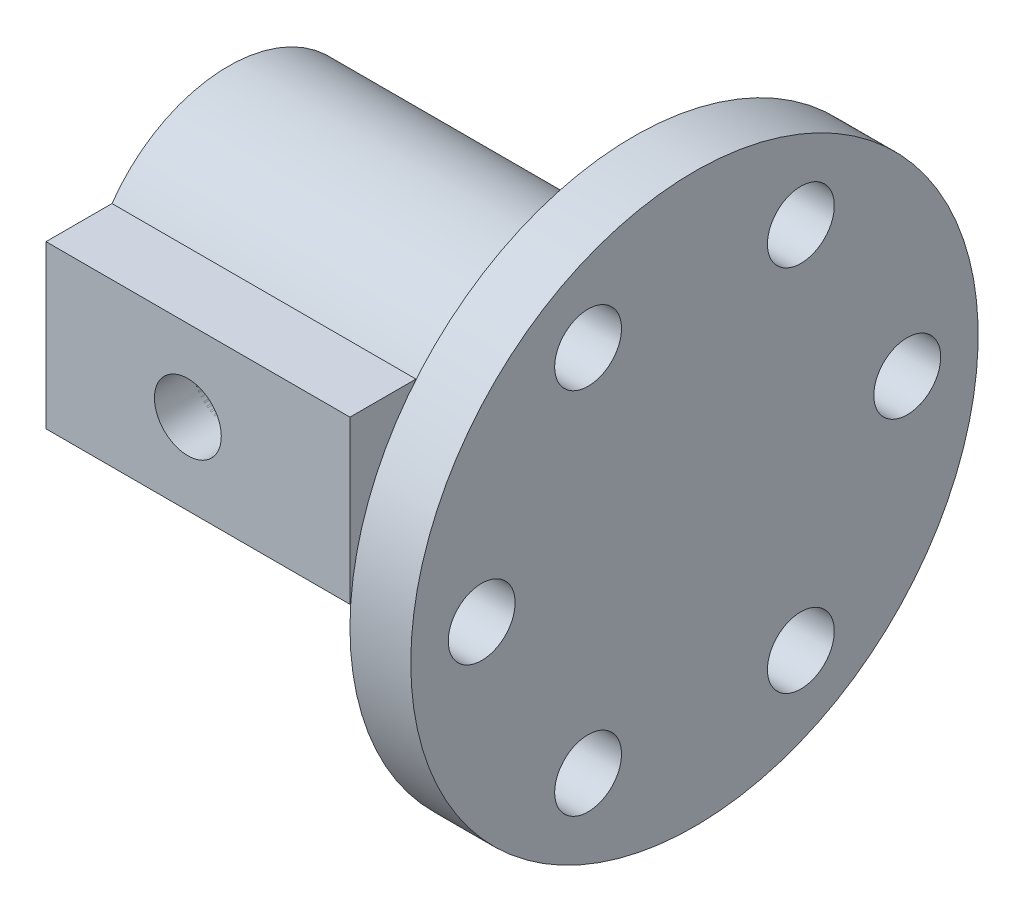
ISO-10303-21;
HEADER;
FILE_DESCRIPTION(('STEP AP214'),'2;1');
FILE_NAME('part.step','',(''),(''),'','','');
FILE_SCHEMA(('AUTOMOTIVE_DESIGN { 1 0 10303 214 1 1 1 1 }'));
ENDSEC;
DATA;
#1=APPLICATION_CONTEXT('core data for automotive mechanical design processes');
#2=APPLICATION_PROTOCOL_DEFINITION('international standard','automotive_design',2000,#1);
#3=PRODUCT_CONTEXT('',#1,'mechanical');
#4=PRODUCT('Part','Part','',(#3));
#5=PRODUCT_RELATED_PRODUCT_CATEGORY('part','',(#4));
#6=PRODUCT_DEFINITION_FORMATION('','',#4);
#7=PRODUCT_DEFINITION_CONTEXT('part definition',#1,'design');
#8=PRODUCT_DEFINITION('design','',#6,#7);
#9=PRODUCT_DEFINITION_SHAPE('','',#8);
#10=(LENGTH_UNIT() NAMED_UNIT(*) SI_UNIT(.MILLI.,.METRE.));
#11=(NAMED_UNIT(*) PLANE_ANGLE_UNIT() SI_UNIT($,.RADIAN.));
#12=(NAMED_UNIT(*) SI_UNIT($,.STERADIAN.) SOLID_ANGLE_UNIT());
#13=UNCERTAINTY_MEASURE_WITH_UNIT(LENGTH_MEASURE(1.E-05),#10,'distance_accuracy_value','');
#14=(GEOMETRIC_REPRESENTATION_CONTEXT(3) GLOBAL_UNCERTAINTY_ASSIGNED_CONTEXT((#13)) GLOBAL_UNIT_ASSIGNED_CONTEXT((#10,
#11,#12)) REPRESENTATION_CONTEXT('',''));
#15=CARTESIAN_POINT('',(0.,0.,0.));
#16=DIRECTION('',(0.,0.,1.));
#17=DIRECTION('',(1.,0.,0.));
#18=AXIS2_PLACEMENT_3D('',#15,#16,#17);
#19=CARTESIAN_POINT('',(0.,4.,5.));
#20=DIRECTION('',(-1.,0.,0.));
#21=DIRECTION('',(0.,-1.,0.));
#22=AXIS2_PLACEMENT_3D('',#19,#20,#21);
#23=PLANE('',#22);
#24=DIRECTION('',(0.,0.,1.));
#25=VECTOR('',#24,1.);
#26=CARTESIAN_POINT('',(0.,-4.,5.));
#27=LINE('',#26,#25);
#28=CARTESIAN_POINT('',(0.,-4.,5.));
#29=VERTEX_POINT('',#28);
#30=CARTESIAN_POINT('',(0.,-4.,9.));
#31=VERTEX_POINT('',#30);
#32=EDGE_CURVE('E52',#29,#31,#27,.T.);
#33=ORIENTED_EDGE('',*,*,#32,.T.);
#34=DIRECTION('',(0.,-1.,0.));
#35=VECTOR('',#34,1.);
#36=CARTESIAN_POINT('',(0.,4.,9.));
#37=LINE('',#36,#35);
#38=CARTESIAN_POINT('',(0.,4.,9.));
#39=VERTEX_POINT('',#38);
#40=EDGE_CURVE('E89',#39,#31,#37,.T.);
#41=ORIENTED_EDGE('',*,*,#40,.F.);
#42=DIRECTION('',(0.,0.,1.));
#43=VECTOR('',#42,1.);
#44=CARTESIAN_POINT('',(0.,4.,5.));
#45=LINE('',#44,#43);
#46=CARTESIAN_POINT('',(0.,4.,5.));
#47=VERTEX_POINT('',#46);
#48=EDGE_CURVE('E12',#47,#39,#45,.T.);
#49=ORIENTED_EDGE('',*,*,#48,.F.);
#50=DIRECTION('',(0.,-1.,0.));
#51=VECTOR('',#50,1.);
#52=CARTESIAN_POINT('',(0.,4.,5.));
#53=LINE('',#52,#51);
#54=EDGE_CURVE('E90',#47,#29,#53,.T.);
#55=ORIENTED_EDGE('',*,*,#54,.T.);
#56=EDGE_LOOP('',(#33,#41,#49,#55));
#57=FACE_BOUND('',#56,.T.);
#58=ADVANCED_FACE('F49',(#57),#23,.T.);
#59=CARTESIAN_POINT('',(0.,4.,5.));
#60=DIRECTION('',(0.,1.,0.));
#61=DIRECTION('',(0.,0.,1.));
#62=AXIS2_PLACEMENT_3D('',#59,#60,#61);
#63=PLANE('',#62);
#64=ORIENTED_EDGE('',*,*,#48,.T.);
#65=DIRECTION('',(-1.,0.,0.));
#66=VECTOR('',#65,1.);
#67=CARTESIAN_POINT('',(0.,4.,9.));
#68=LINE('',#67,#66);
#69=CARTESIAN_POINT('',(15.,4.,9.));
#70=VERTEX_POINT('',#69);
#71=EDGE_CURVE('E107',#70,#39,#68,.T.);
#72=ORIENTED_EDGE('',*,*,#71,.F.);
#73=DIRECTION('',(0.,0.,1.));
#74=VECTOR('',#73,1.);
#75=CARTESIAN_POINT('',(15.,4.,5.));
#76=LINE('',#75,#74);
#77=CARTESIAN_POINT('',(15.,4.,5.));
#78=VERTEX_POINT('',#77);
#79=EDGE_CURVE('E57',#78,#70,#76,.T.);
#80=ORIENTED_EDGE('',*,*,#79,.F.);
#81=DIRECTION('',(-1.,0.,0.));
#82=VECTOR('',#81,1.);
#83=CARTESIAN_POINT('',(0.,4.,5.));
#84=LINE('',#83,#82);
#85=EDGE_CURVE('E95',#78,#47,#84,.T.);
#86=ORIENTED_EDGE('',*,*,#85,.T.);
#87=EDGE_LOOP('',(#64,#72,#80,#86));
#88=FACE_BOUND('',#87,.T.);
#89=ADVANCED_FACE('F128',(#88),#63,.T.);
#90=CARTESIAN_POINT('',(15.,4.,5.));
#91=DIRECTION('',(1.,0.,0.));
#92=DIRECTION('',(0.,1.,0.));
#93=AXIS2_PLACEMENT_3D('',#90,#91,#92);
#94=PLANE('',#93);
#95=ORIENTED_EDGE('',*,*,#79,.T.);
#96=DIRECTION('',(0.,1.,0.));
#97=VECTOR('',#96,1.);
#98=CARTESIAN_POINT('',(15.,4.,9.));
#99=LINE('',#98,#97);
#100=CARTESIAN_POINT('',(15.,-4.,9.));
#101=VERTEX_POINT('',#100);
#102=EDGE_CURVE('E102',#101,#70,#99,.T.);
#103=ORIENTED_EDGE('',*,*,#102,.F.);
#104=DIRECTION('',(0.,0.,1.));
#105=VECTOR('',#104,1.);
#106=CARTESIAN_POINT('',(15.,-4.,5.));
#107=LINE('',#106,#105);
#108=CARTESIAN_POINT('',(15.,-4.,5.));
#109=VERTEX_POINT('',#108);
#110=EDGE_CURVE('E94',#109,#101,#107,.T.);
#111=ORIENTED_EDGE('',*,*,#110,.F.);
#112=DIRECTION('',(0.,1.,0.));
#113=VECTOR('',#112,1.);
#114=CARTESIAN_POINT('',(15.,4.,5.));
#115=LINE('',#114,#113);
#116=EDGE_CURVE('E121',#109,#78,#115,.T.);
#117=ORIENTED_EDGE('',*,*,#116,.T.);
#118=EDGE_LOOP('',(#95,#103,#111,#117));
#119=FACE_BOUND('',#118,.T.);
#120=ADVANCED_FACE('F125',(#119),#94,.T.);
#121=CARTESIAN_POINT('',(0.,-4.,5.));
#122=DIRECTION('',(0.,-1.,0.));
#123=DIRECTION('',(0.,0.,-1.));
#124=AXIS2_PLACEMENT_3D('',#121,#122,#123);
#125=PLANE('',#124);
#126=ORIENTED_EDGE('',*,*,#110,.T.);
#127=DIRECTION('',(1.,0.,0.));
#128=VECTOR('',#127,1.);
#129=CARTESIAN_POINT('',(0.,-4.,9.));
#130=LINE('',#129,#128);
#131=EDGE_CURVE('E97',#31,#101,#130,.T.);
#132=ORIENTED_EDGE('',*,*,#131,.F.);
#133=ORIENTED_EDGE('',*,*,#32,.F.);
#134=DIRECTION('',(1.,0.,0.));
#135=VECTOR('',#134,1.);
#136=CARTESIAN_POINT('',(0.,-4.,5.));
#137=LINE('',#136,#135);
#138=EDGE_CURVE('E119',#29,#109,#137,.T.);
#139=ORIENTED_EDGE('',*,*,#138,.T.);
#140=EDGE_LOOP('',(#126,#132,#133,#139));
#141=FACE_BOUND('',#140,.T.);
#142=ADVANCED_FACE('F98',(#141),#125,.T.);
#143=CARTESIAN_POINT('',(0.,0.,5.));
#144=DIRECTION('',(0.,0.,1.));
#145=DIRECTION('',(1.,0.,0.));
#146=AXIS2_PLACEMENT_3D('',#143,#144,#145);
#147=PLANE('',#146);
#148=CARTESIAN_POINT('',(7.,0.,5.));
#149=DIRECTION('',(0.,0.,1.));
#150=DIRECTION('',(1.,0.,0.));
#151=AXIS2_PLACEMENT_3D('',#148,#149,#150);
#152=CIRCLE('',#151,1.65);
#153=CARTESIAN_POINT('',(8.65,0.,5.));
#154=VERTEX_POINT('',#153);
#155=EDGE_CURVE('E115',#154,#154,#152,.T.);
#156=ORIENTED_EDGE('',*,*,#155,.T.);
#157=EDGE_LOOP('',(#156));
#158=FACE_BOUND('',#157,.T.);
#159=ORIENTED_EDGE('',*,*,#54,.F.);
#160=ORIENTED_EDGE('',*,*,#85,.F.);
#161=ORIENTED_EDGE('',*,*,#116,.F.);
#162=ORIENTED_EDGE('',*,*,#138,.F.);
#163=EDGE_LOOP('',(#159,#160,#161,#162));
#164=FACE_BOUND('',#163,.T.);
#165=ADVANCED_FACE('F130',(#158,#164),#147,.F.);
#166=CARTESIAN_POINT('',(7.,0.,5.));
#167=DIRECTION('',(0.,0.,1.));
#168=DIRECTION('',(1.,0.,0.));
#169=AXIS2_PLACEMENT_3D('',#166,#167,#168);
#170=CYLINDRICAL_SURFACE('',#169,1.65);
#171=ORIENTED_EDGE('',*,*,#155,.F.);
#172=EDGE_LOOP('',(#171));
#173=FACE_BOUND('',#172,.T.);
#174=CARTESIAN_POINT('',(7.,0.,9.));
#175=DIRECTION('',(0.,0.,1.));
#176=DIRECTION('',(1.,0.,0.));
#177=AXIS2_PLACEMENT_3D('',#174,#175,#176);
#178=CIRCLE('',#177,1.65);
#179=CARTESIAN_POINT('',(8.65,0.,9.));
#180=VERTEX_POINT('',#179);
#181=EDGE_CURVE('E108',#180,#180,#178,.T.);
#182=ORIENTED_EDGE('',*,*,#181,.T.);
#183=EDGE_LOOP('',(#182));
#184=FACE_BOUND('',#183,.T.);
#185=ADVANCED_FACE('F132',(#173,#184),#170,.F.);
#186=CARTESIAN_POINT('',(0.,0.,9.));
#187=DIRECTION('',(0.,0.,1.));
#188=DIRECTION('',(1.,0.,0.));
#189=AXIS2_PLACEMENT_3D('',#186,#187,#188);
#190=PLANE('',#189);
#191=ORIENTED_EDGE('',*,*,#40,.T.);
#192=ORIENTED_EDGE('',*,*,#131,.T.);
#193=ORIENTED_EDGE('',*,*,#102,.T.);
#194=ORIENTED_EDGE('',*,*,#71,.T.);
#195=EDGE_LOOP('',(#191,#192,#193,#194));
#196=FACE_BOUND('',#195,.T.);
#197=ORIENTED_EDGE('',*,*,#181,.F.);
#198=EDGE_LOOP('',(#197));
#199=FACE_BOUND('',#198,.T.);
#200=ADVANCED_FACE('F105',(#196,#199),#190,.T.);
#201=CLOSED_SHELL('',(#58,#89,#120,#142,#165,#185,#200));
#202=MANIFOLD_SOLID_BREP('B2',#201);
#203=CARTESIAN_POINT('',(0.,0.,0.));
#204=DIRECTION('',(1.,0.,0.));
#205=DIRECTION('',(0.,0.,-1.));
#206=AXIS2_PLACEMENT_3D('',#203,#204,#205);
#207=PLANE('',#206);
#208=CARTESIAN_POINT('',(0.,0.,0.));
#209=DIRECTION('',(-1.,0.,0.));
#210=DIRECTION('',(0.,0.,1.));
#211=AXIS2_PLACEMENT_3D('',#208,#209,#210);
#212=CIRCLE('',#211,3.15);
#213=CARTESIAN_POINT('',(0.,0.,3.15));
#214=VERTEX_POINT('',#213);
#215=EDGE_CURVE('E238',#214,#214,#212,.T.);
#216=ORIENTED_EDGE('',*,*,#215,.F.);
#217=EDGE_LOOP('',(#216));
#218=FACE_BOUND('',#217,.T.);
#219=CARTESIAN_POINT('',(0.,0.,0.));
#220=DIRECTION('',(-1.,0.,0.));
#221=DIRECTION('',(0.,0.,1.));
#222=AXIS2_PLACEMENT_3D('',#219,#220,#221);
#223=CIRCLE('',#222,7.);
#224=CARTESIAN_POINT('',(0.,0.,7.));
#225=VERTEX_POINT('',#224);
#226=EDGE_CURVE('E205',#225,#225,#223,.T.);
#227=ORIENTED_EDGE('',*,*,#226,.T.);
#228=EDGE_LOOP('',(#227));
#229=FACE_BOUND('',#228,.T.);
#230=ADVANCED_FACE('F194',(#218,#229),#207,.F.);
#231=CARTESIAN_POINT('',(0.,0.,0.));
#232=DIRECTION('',(-1.,0.,0.));
#233=DIRECTION('',(0.,0.,1.));
#234=AXIS2_PLACEMENT_3D('',#231,#232,#233);
#235=CYLINDRICAL_SURFACE('',#234,7.);
#236=CARTESIAN_POINT('',(19.,0.,0.));
#237=DIRECTION('',(1.,0.,0.));
#238=DIRECTION('',(0.,0.,-1.));
#239=AXIS2_PLACEMENT_3D('',#236,#237,#238);
#240=CIRCLE('',#239,7.);
#241=CARTESIAN_POINT('',(19.,0.,-7.));
#242=VERTEX_POINT('',#241);
#243=EDGE_CURVE('E201',#242,#242,#240,.F.);
#244=ORIENTED_EDGE('',*,*,#243,.T.);
#245=EDGE_LOOP('',(#244));
#246=FACE_BOUND('',#245,.T.);
#247=CARTESIAN_POINT('',(8.65,0.,7.));
#248=CARTESIAN_POINT('',(8.64999715612092,-0.0913287393176135,6.99999836647252));
#249=CARTESIAN_POINT('',(8.64239176915064,-0.182690417283303,6.99819467849873));
#250=CARTESIAN_POINT('',(8.61221009853048,-0.362806323664361,6.9911739036526));
#251=CARTESIAN_POINT('',(8.58962428672524,-0.451558855012934,6.98595464436712));
#252=CARTESIAN_POINT('',(8.53023822598253,-0.623828476855957,6.97268218331077));
#253=CARTESIAN_POINT('',(8.49345400799298,-0.707351348819676,6.96463217854926));
#254=CARTESIAN_POINT('',(8.40676915128466,-0.867039208328408,6.9465609541058));
#255=CARTESIAN_POINT('',(8.35686843304705,-0.943204151262114,6.93653972247338));
#256=CARTESIAN_POINT('',(8.24439317834774,-1.0874214344422,6.91541181493805));
#257=CARTESIAN_POINT('',(8.18162244644474,-1.15531854158778,6.90428991213628));
#258=CARTESIAN_POINT('',(8.04560959082672,-1.27972508274131,6.88231817514457));
#259=CARTESIAN_POINT('',(7.97236640897828,-1.33623336463363,6.87146836857753));
#260=CARTESIAN_POINT('',(7.81630963254398,-1.43696684618771,6.85111743990827));
#261=CARTESIAN_POINT('',(7.7333837495766,-1.48102236520305,6.84163573776828));
#262=CARTESIAN_POINT('',(7.56104427829788,-1.5545098915109,6.8253150534534));
#263=CARTESIAN_POINT('',(7.47163160394849,-1.58394395433771,6.81847569983818));
#264=CARTESIAN_POINT('',(7.29055302796902,-1.62683125284546,6.80836995693016));
#265=CARTESIAN_POINT('',(7.19895629577561,-1.64056162843084,6.80504168835829));
#266=CARTESIAN_POINT('',(7.01470364633588,-1.65251435457551,6.80214944752778));
#267=CARTESIAN_POINT('',(6.92204788316596,-1.65073893306961,6.80258493447765));
#268=CARTESIAN_POINT('',(6.74040081920414,-1.63195247769315,6.80711518628286));
#269=CARTESIAN_POINT('',(6.65137352003667,-1.61526770664355,6.81113158544196));
#270=CARTESIAN_POINT('',(6.47741848048742,-1.56765494743684,6.82224669705885));
#271=CARTESIAN_POINT('',(6.39249100344399,-1.53672604569693,6.82934560721949));
#272=CARTESIAN_POINT('',(6.22825160294738,-1.46121486998613,6.84590028619908));
#273=CARTESIAN_POINT('',(6.14899783060348,-1.41651088097455,6.85537691977426));
#274=CARTESIAN_POINT('',(5.99899787905211,-1.31480384080152,6.87560701771075));
#275=CARTESIAN_POINT('',(5.92825303741629,-1.25779885989579,6.88636068228984));
#276=CARTESIAN_POINT('',(5.79540520230351,-1.13140044923306,6.90826612497408));
#277=CARTESIAN_POINT('',(5.73356537204603,-1.06173067039408,6.91942110106381));
#278=CARTESIAN_POINT('',(5.62240035299906,-0.912878848692461,6.940626418642));
#279=CARTESIAN_POINT('',(5.57307546763307,-0.833696575268991,6.95067673334471));
#280=CARTESIAN_POINT('',(5.48825897652052,-0.667717693598602,6.96858169507369));
#281=CARTESIAN_POINT('',(5.45280620132093,-0.580900533100763,6.97643016161575));
#282=CARTESIAN_POINT('',(5.39706844656342,-0.402313719817368,6.98900179511064));
#283=CARTESIAN_POINT('',(5.37678089612248,-0.310544909289168,6.99372549177409));
#284=CARTESIAN_POINT('',(5.35234231566717,-0.12691319889921,6.9994383716222));
#285=CARTESIAN_POINT('',(5.34783240330128,-0.0351005767602221,7.00051059686152));
#286=CARTESIAN_POINT('',(5.35409827636913,0.147966685501655,6.99903444009398));
#287=CARTESIAN_POINT('',(5.36487284761622,0.239221369368363,6.99648634568227));
#288=CARTESIAN_POINT('',(5.40110507923741,0.417362653019771,6.98810869992012));
#289=CARTESIAN_POINT('',(5.42637051352431,0.504290552421104,6.98232213187253));
#290=CARTESIAN_POINT('',(5.49065065087642,0.672672276070121,6.96811723407212));
#291=CARTESIAN_POINT('',(5.52966664699561,0.754125584648712,6.9596986568229));
#292=CARTESIAN_POINT('',(5.62106042208636,0.910700498955398,6.94096161251794));
#293=CARTESIAN_POINT('',(5.67364386057601,0.985698570997653,6.93061465221504));
#294=CARTESIAN_POINT('',(5.79041331924251,1.1259344495591,6.90921937825115));
#295=CARTESIAN_POINT('',(5.85460110716109,1.19117076625592,6.89817095790026));
#296=CARTESIAN_POINT('',(5.99441505530595,1.31148229591091,6.87632466673189));
#297=CARTESIAN_POINT('',(6.07025861259663,1.36630717929423,6.865537385707));
#298=CARTESIAN_POINT('',(6.23028479232451,1.46244648293613,6.84570445168463));
#299=CARTESIAN_POINT('',(6.31446704173642,1.50376150719305,6.83665872083342));
#300=CARTESIAN_POINT('',(6.48832127446082,1.57141076668764,6.82142736146697));
#301=CARTESIAN_POINT('',(6.57795752685843,1.59783286852027,6.81522499881539));
#302=CARTESIAN_POINT('',(6.76056565583675,1.63519178674544,6.80635903572141));
#303=CARTESIAN_POINT('',(6.85353689432124,1.64613154940225,6.80369476199233));
#304=CARTESIAN_POINT('',(7.03764007583629,1.65207449167986,6.80225382726605));
#305=CARTESIAN_POINT('',(7.12875861310138,1.6474761616919,6.80337995460539));
#306=CARTESIAN_POINT('',(7.30888236366682,1.62337546677893,6.80917049161347));
#307=CARTESIAN_POINT('',(7.39788761066538,1.60387333967241,6.81383484482306));
#308=CARTESIAN_POINT('',(7.57088010606271,1.55072477614989,6.82612522897376));
#309=CARTESIAN_POINT('',(7.65488895775151,1.51714519678737,6.83373724790254));
#310=CARTESIAN_POINT('',(7.81613651147967,1.43684939858625,6.85106877692285));
#311=CARTESIAN_POINT('',(7.89337437975524,1.39013156490448,6.86078854604759));
#312=CARTESIAN_POINT('',(8.04083165170259,1.28360204537892,6.88152384189012));
#313=CARTESIAN_POINT('',(8.11084523110531,1.22351026298738,6.89256431174074));
#314=CARTESIAN_POINT('',(8.23992483888991,1.09249493531384,6.91453965388042));
#315=CARTESIAN_POINT('',(8.2989883028659,1.02156885982584,6.92547450086676));
#316=CARTESIAN_POINT('',(8.40538285532999,0.869562734220028,6.94620969725689));
#317=CARTESIAN_POINT('',(8.45251645356407,0.788341489140676,6.95598967744618));
#318=CARTESIAN_POINT('',(8.53238620957199,0.618909771082386,6.97310375804726));
#319=CARTESIAN_POINT('',(8.56513352737679,0.530704778601511,6.98043975328753));
#320=CARTESIAN_POINT('',(8.60997422050049,0.368778884805455,6.99064750922865));
#321=CARTESIAN_POINT('',(8.62495329121565,0.295881946838861,6.99413174237217));
#322=CARTESIAN_POINT('',(8.64496704386653,0.148663891408629,6.99880858473134));
#323=CARTESIAN_POINT('',(8.65000231495695,0.0743428585838589,7.00000132971399));
#324=CARTESIAN_POINT('',(8.65,0.,7.));
#325=B_SPLINE_CURVE_WITH_KNOTS('',3,(#247,#248,#249,#250,#251,#252,#253,#254,#255,#256,#257,
#258,#259,#260,#261,#262,#263,#264,#265,#266,#267,#268,#269,#270,#271,#272,#273,#274,#275,#276,
#277,#278,#279,#280,#281,#282,#283,#284,#285,#286,#287,#288,#289,#290,#291,#292,#293,#294,#295,
#296,#297,#298,#299,#300,#301,#302,#303,#304,#305,#306,#307,#308,#309,#310,#311,#312,#313,#314,
#315,#316,#317,#318,#319,#320,#321,#322,#323,#324),.UNSPECIFIED.,.T.,.F.,(4,2,2,2,2,2,2,2,2,2,2,
2,2,2,2,2,2,2,2,2,2,2,2,2,2,2,2,2,2,2,2,2,2,2,2,2,2,2,4),(0.,0.273713930465044,
0.547602121208314,0.82118197421838,1.09476348584583,1.37287554367487,1.65101572175226,
1.93278083587447,2.21450632727553,2.49117922951627,2.76781237894395,3.0385362810522,
3.30927754913057,3.58248319512941,3.85573173204488,4.13587649000043,4.41602803938654,
4.69695826763982,4.97784086042084,5.25229133365971,5.52672000600246,5.79758981692428,
6.06848510628021,6.34375631656429,6.61906949551376,6.9003381998144,7.18159432744314,
7.46117322376554,7.74069890951611,8.01311084713954,8.28551843800229,8.55664670189891,
8.82780830516573,9.10529722607675,9.38285105021364,9.66473658497752,9.94640306170603,
10.1692231938147,10.3920301237804),.UNSPECIFIED.);
#326=CARTESIAN_POINT('',(8.65,0.,7.));
#327=VERTEX_POINT('',#326);
#328=EDGE_CURVE('E219',#327,#327,#325,.T.);
#329=ORIENTED_EDGE('',*,*,#328,.T.);
#330=EDGE_LOOP('',(#329));
#331=FACE_BOUND('',#330,.T.);
#332=ORIENTED_EDGE('',*,*,#226,.F.);
#333=EDGE_LOOP('',(#332));
#334=FACE_BOUND('',#333,.T.);
#335=ADVANCED_FACE('F241',(#246,#331,#334),#235,.T.);
#336=CARTESIAN_POINT('',(20.,0.,-7.));
#337=DIRECTION('',(1.,0.,0.));
#338=DIRECTION('',(0.,0.,-1.));
#339=AXIS2_PLACEMENT_3D('',#336,#337,#338);
#340=PLANE('',#339);
#341=CARTESIAN_POINT('',(20.,0.,0.));
#342=DIRECTION('',(1.,0.,0.));
#343=DIRECTION('',(0.,0.,-1.));
#344=AXIS2_PLACEMENT_3D('',#341,#342,#343);
#345=CIRCLE('',#344,8.);
#346=CARTESIAN_POINT('',(20.,0.,-8.));
#347=VERTEX_POINT('',#346);
#348=EDGE_CURVE('E48',#347,#347,#345,.T.);
#349=ORIENTED_EDGE('',*,*,#348,.T.);
#350=EDGE_LOOP('',(#349));
#351=FACE_BOUND('',#350,.T.);
#352=CARTESIAN_POINT('',(20.,0.,10.5));
#353=DIRECTION('',(-1.,0.,0.));
#354=DIRECTION('',(0.,0.,1.));
#355=AXIS2_PLACEMENT_3D('',#352,#353,#354);
#356=CIRCLE('',#355,1.65);
#357=CARTESIAN_POINT('',(20.,0.,12.15));
#358=VERTEX_POINT('',#357);
#359=EDGE_CURVE('E262',#358,#358,#356,.T.);
#360=ORIENTED_EDGE('',*,*,#359,.F.);
#361=EDGE_LOOP('',(#360));
#362=FACE_BOUND('',#361,.T.);
#363=CARTESIAN_POINT('',(20.,9.09326673973661,5.24999999999999));
#364=DIRECTION('',(-1.,0.,0.));
#365=DIRECTION('',(0.,0.,1.));
#366=AXIS2_PLACEMENT_3D('',#363,#364,#365);
#367=CIRCLE('',#366,1.65);
#368=CARTESIAN_POINT('',(20.,9.09326673973661,6.89999999999999));
#369=VERTEX_POINT('',#368);
#370=EDGE_CURVE('E272',#369,#369,#367,.T.);
#371=ORIENTED_EDGE('',*,*,#370,.F.);
#372=EDGE_LOOP('',(#371));
#373=FACE_BOUND('',#372,.T.);
#374=CARTESIAN_POINT('',(20.,9.0932667397366,-5.25));
#375=DIRECTION('',(-1.,0.,0.));
#376=DIRECTION('',(0.,0.,1.));
#377=AXIS2_PLACEMENT_3D('',#374,#375,#376);
#378=CIRCLE('',#377,1.65);
#379=CARTESIAN_POINT('',(20.,9.0932667397366,-3.6));
#380=VERTEX_POINT('',#379);
#381=EDGE_CURVE('E291',#380,#380,#378,.T.);
#382=ORIENTED_EDGE('',*,*,#381,.F.);
#383=EDGE_LOOP('',(#382));
#384=FACE_BOUND('',#383,.T.);
#385=CARTESIAN_POINT('',(20.,0.,-10.5));
#386=DIRECTION('',(-1.,0.,0.));
#387=DIRECTION('',(0.,0.,1.));
#388=AXIS2_PLACEMENT_3D('',#385,#386,#387);
#389=CIRCLE('',#388,1.65);
#390=CARTESIAN_POINT('',(20.,0.,-8.85));
#391=VERTEX_POINT('',#390);
#392=EDGE_CURVE('E285',#391,#391,#389,.T.);
#393=ORIENTED_EDGE('',*,*,#392,.F.);
#394=EDGE_LOOP('',(#393));
#395=FACE_BOUND('',#394,.T.);
#396=CARTESIAN_POINT('',(20.,-9.09326673973661,-5.25));
#397=DIRECTION('',(-1.,0.,0.));
#398=DIRECTION('',(0.,0.,1.));
#399=AXIS2_PLACEMENT_3D('',#396,#397,#398);
#400=CIRCLE('',#399,1.65);
#401=CARTESIAN_POINT('',(20.,-9.09326673973661,-3.6));
#402=VERTEX_POINT('',#401);
#403=EDGE_CURVE('E279',#402,#402,#400,.T.);
#404=ORIENTED_EDGE('',*,*,#403,.F.);
#405=EDGE_LOOP('',(#404));
#406=FACE_BOUND('',#405,.T.);
#407=CARTESIAN_POINT('',(20.,-9.09326673973661,5.25));
#408=DIRECTION('',(-1.,0.,0.));
#409=DIRECTION('',(0.,0.,1.));
#410=AXIS2_PLACEMENT_3D('',#407,#408,#409);
#411=CIRCLE('',#410,1.65);
#412=CARTESIAN_POINT('',(20.,-9.09326673973661,6.9));
#413=VERTEX_POINT('',#412);
#414=EDGE_CURVE('E266',#413,#413,#411,.T.);
#415=ORIENTED_EDGE('',*,*,#414,.F.);
#416=EDGE_LOOP('',(#415));
#417=FACE_BOUND('',#416,.T.);
#418=CARTESIAN_POINT('',(20.,0.,0.));
#419=DIRECTION('',(-1.,0.,0.));
#420=DIRECTION('',(0.,0.,1.));
#421=AXIS2_PLACEMENT_3D('',#418,#419,#420);
#422=CIRCLE('',#421,14.);
#423=CARTESIAN_POINT('',(20.,0.,14.));
#424=VERTEX_POINT('',#423);
#425=EDGE_CURVE('E209',#424,#424,#422,.T.);
#426=ORIENTED_EDGE('',*,*,#425,.T.);
#427=EDGE_LOOP('',(#426));
#428=FACE_BOUND('',#427,.T.);
#429=ADVANCED_FACE('F245',(#351,#362,#373,#384,#395,#406,#417,#428),#340,.F.);
#430=CARTESIAN_POINT('',(0.,0.,0.));
#431=DIRECTION('',(-1.,0.,0.));
#432=DIRECTION('',(0.,0.,1.));
#433=AXIS2_PLACEMENT_3D('',#430,#431,#432);
#434=CYLINDRICAL_SURFACE('',#433,14.);
#435=ORIENTED_EDGE('',*,*,#425,.F.);
#436=EDGE_LOOP('',(#435));
#437=FACE_BOUND('',#436,.T.);
#438=CARTESIAN_POINT('',(23.,0.,0.));
#439=DIRECTION('',(-1.,0.,0.));
#440=DIRECTION('',(0.,0.,1.));
#441=AXIS2_PLACEMENT_3D('',#438,#439,#440);
#442=CIRCLE('',#441,14.);
#443=CARTESIAN_POINT('',(23.,0.,14.));
#444=VERTEX_POINT('',#443);
#445=EDGE_CURVE('E269',#444,#444,#442,.T.);
#446=ORIENTED_EDGE('',*,*,#445,.T.);
#447=EDGE_LOOP('',(#446));
#448=FACE_BOUND('',#447,.T.);
#449=ADVANCED_FACE('F303',(#437,#448),#434,.T.);
#450=CARTESIAN_POINT('',(23.,0.,-14.));
#451=DIRECTION('',(-1.,0.,0.));
#452=DIRECTION('',(0.,0.,1.));
#453=AXIS2_PLACEMENT_3D('',#450,#451,#452);
#454=PLANE('',#453);
#455=CARTESIAN_POINT('',(23.,0.,10.5));
#456=DIRECTION('',(-1.,0.,0.));
#457=DIRECTION('',(0.,0.,1.));
#458=AXIS2_PLACEMENT_3D('',#455,#456,#457);
#459=CIRCLE('',#458,1.65);
#460=CARTESIAN_POINT('',(23.,0.,12.15));
#461=VERTEX_POINT('',#460);
#462=EDGE_CURVE('E265',#461,#461,#459,.F.);
#463=ORIENTED_EDGE('',*,*,#462,.F.);
#464=EDGE_LOOP('',(#463));
#465=FACE_BOUND('',#464,.T.);
#466=CARTESIAN_POINT('',(23.,9.09326673973661,5.24999999999999));
#467=DIRECTION('',(-1.,0.,0.));
#468=DIRECTION('',(0.,0.,1.));
#469=AXIS2_PLACEMENT_3D('',#466,#467,#468);
#470=CIRCLE('',#469,1.65);
#471=CARTESIAN_POINT('',(23.,9.09326673973661,6.89999999999999));
#472=VERTEX_POINT('',#471);
#473=EDGE_CURVE('E260',#472,#472,#470,.F.);
#474=ORIENTED_EDGE('',*,*,#473,.F.);
#475=EDGE_LOOP('',(#474));
#476=FACE_BOUND('',#475,.T.);
#477=CARTESIAN_POINT('',(23.,9.0932667397366,-5.25));
#478=DIRECTION('',(-1.,0.,0.));
#479=DIRECTION('',(0.,0.,1.));
#480=AXIS2_PLACEMENT_3D('',#477,#478,#479);
#481=CIRCLE('',#480,1.65);
#482=CARTESIAN_POINT('',(23.,9.0932667397366,-3.6));
#483=VERTEX_POINT('',#482);
#484=EDGE_CURVE('E275',#483,#483,#481,.F.);
#485=ORIENTED_EDGE('',*,*,#484,.F.);
#486=EDGE_LOOP('',(#485));
#487=FACE_BOUND('',#486,.T.);
#488=CARTESIAN_POINT('',(23.,0.,-10.5));
#489=DIRECTION('',(-1.,0.,0.));
#490=DIRECTION('',(0.,0.,1.));
#491=AXIS2_PLACEMENT_3D('',#488,#489,#490);
#492=CIRCLE('',#491,1.65);
#493=CARTESIAN_POINT('',(23.,0.,-8.85));
#494=VERTEX_POINT('',#493);
#495=EDGE_CURVE('E288',#494,#494,#492,.F.);
#496=ORIENTED_EDGE('',*,*,#495,.F.);
#497=EDGE_LOOP('',(#496));
#498=FACE_BOUND('',#497,.T.);
#499=CARTESIAN_POINT('',(23.,-9.09326673973661,-5.25));
#500=DIRECTION('',(-1.,0.,0.));
#501=DIRECTION('',(0.,0.,1.));
#502=AXIS2_PLACEMENT_3D('',#499,#500,#501);
#503=CIRCLE('',#502,1.65);
#504=CARTESIAN_POINT('',(23.,-9.09326673973661,-3.6));
#505=VERTEX_POINT('',#504);
#506=EDGE_CURVE('E282',#505,#505,#503,.F.);
#507=ORIENTED_EDGE('',*,*,#506,.F.);
#508=EDGE_LOOP('',(#507));
#509=FACE_BOUND('',#508,.T.);
#510=CARTESIAN_POINT('',(23.,-9.09326673973661,5.25));
#511=DIRECTION('',(-1.,0.,0.));
#512=DIRECTION('',(0.,0.,1.));
#513=AXIS2_PLACEMENT_3D('',#510,#511,#512);
#514=CIRCLE('',#513,1.65);
#515=CARTESIAN_POINT('',(23.,-9.09326673973661,6.9));
#516=VERTEX_POINT('',#515);
#517=EDGE_CURVE('E276',#516,#516,#514,.F.);
#518=ORIENTED_EDGE('',*,*,#517,.F.);
#519=EDGE_LOOP('',(#518));
#520=FACE_BOUND('',#519,.T.);
#521=ORIENTED_EDGE('',*,*,#445,.F.);
#522=EDGE_LOOP('',(#521));
#523=FACE_BOUND('',#522,.T.);
#524=ADVANCED_FACE('F306',(#465,#476,#487,#498,#509,#520,#523),#454,.F.);
#525=CARTESIAN_POINT('',(23.001,-9.09326673973661,5.25));
#526=DIRECTION('',(-1.,0.,0.));
#527=DIRECTION('',(0.,0.,1.));
#528=AXIS2_PLACEMENT_3D('',#525,#526,#527);
#529=CYLINDRICAL_SURFACE('',#528,1.65);
#530=ORIENTED_EDGE('',*,*,#414,.T.);
#531=EDGE_LOOP('',(#530));
#532=FACE_BOUND('',#531,.T.);
#533=ORIENTED_EDGE('',*,*,#517,.T.);
#534=EDGE_LOOP('',(#533));
#535=FACE_BOUND('',#534,.T.);
#536=ADVANCED_FACE('F310',(#532,#535),#529,.F.);
#537=CARTESIAN_POINT('',(23.001,-9.09326673973661,-5.25));
#538=DIRECTION('',(-1.,0.,0.));
#539=DIRECTION('',(0.,0.,1.));
#540=AXIS2_PLACEMENT_3D('',#537,#538,#539);
#541=CYLINDRICAL_SURFACE('',#540,1.65);
#542=ORIENTED_EDGE('',*,*,#403,.T.);
#543=EDGE_LOOP('',(#542));
#544=FACE_BOUND('',#543,.T.);
#545=ORIENTED_EDGE('',*,*,#506,.T.);
#546=EDGE_LOOP('',(#545));
#547=FACE_BOUND('',#546,.T.);
#548=ADVANCED_FACE('F316',(#544,#547),#541,.F.);
#549=CARTESIAN_POINT('',(23.001,0.,-10.5));
#550=DIRECTION('',(-1.,0.,0.));
#551=DIRECTION('',(0.,0.,1.));
#552=AXIS2_PLACEMENT_3D('',#549,#550,#551);
#553=CYLINDRICAL_SURFACE('',#552,1.65);
#554=ORIENTED_EDGE('',*,*,#392,.T.);
#555=EDGE_LOOP('',(#554));
#556=FACE_BOUND('',#555,.T.);
#557=ORIENTED_EDGE('',*,*,#495,.T.);
#558=EDGE_LOOP('',(#557));
#559=FACE_BOUND('',#558,.T.);
#560=ADVANCED_FACE('F326',(#556,#559),#553,.F.);
#561=CARTESIAN_POINT('',(23.001,9.0932667397366,-5.25));
#562=DIRECTION('',(-1.,0.,0.));
#563=DIRECTION('',(0.,0.,1.));
#564=AXIS2_PLACEMENT_3D('',#561,#562,#563);
#565=CYLINDRICAL_SURFACE('',#564,1.65);
#566=ORIENTED_EDGE('',*,*,#381,.T.);
#567=EDGE_LOOP('',(#566));
#568=FACE_BOUND('',#567,.T.);
#569=ORIENTED_EDGE('',*,*,#484,.T.);
#570=EDGE_LOOP('',(#569));
#571=FACE_BOUND('',#570,.T.);
#572=ADVANCED_FACE('F322',(#568,#571),#565,.F.);
#573=CARTESIAN_POINT('',(23.001,9.09326673973661,5.24999999999999));
#574=DIRECTION('',(-1.,0.,0.));
#575=DIRECTION('',(0.,0.,1.));
#576=AXIS2_PLACEMENT_3D('',#573,#574,#575);
#577=CYLINDRICAL_SURFACE('',#576,1.65);
#578=ORIENTED_EDGE('',*,*,#370,.T.);
#579=EDGE_LOOP('',(#578));
#580=FACE_BOUND('',#579,.T.);
#581=ORIENTED_EDGE('',*,*,#473,.T.);
#582=EDGE_LOOP('',(#581));
#583=FACE_BOUND('',#582,.T.);
#584=ADVANCED_FACE('F325',(#580,#583),#577,.F.);
#585=CARTESIAN_POINT('',(23.001,0.,10.5));
#586=DIRECTION('',(-1.,0.,0.));
#587=DIRECTION('',(0.,0.,1.));
#588=AXIS2_PLACEMENT_3D('',#585,#586,#587);
#589=CYLINDRICAL_SURFACE('',#588,1.65);
#590=ORIENTED_EDGE('',*,*,#359,.T.);
#591=EDGE_LOOP('',(#590));
#592=FACE_BOUND('',#591,.T.);
#593=ORIENTED_EDGE('',*,*,#462,.T.);
#594=EDGE_LOOP('',(#593));
#595=FACE_BOUND('',#594,.T.);
#596=ADVANCED_FACE('F335',(#592,#595),#589,.F.);
#597=CARTESIAN_POINT('',(13.,0.,0.));
#598=DIRECTION('',(-1.,0.,0.));
#599=DIRECTION('',(0.,0.,1.));
#600=AXIS2_PLACEMENT_3D('',#597,#598,#599);
#601=CYLINDRICAL_SURFACE('',#600,3.15);
#602=CARTESIAN_POINT('',(8.65,0.,3.15));
#603=CARTESIAN_POINT('',(8.64999438630437,0.0862406013740153,3.1499950292789));
#604=CARTESIAN_POINT('',(8.64319920208716,0.172568792243279,3.14642124299997));
#605=CARTESIAN_POINT('',(8.61633419195945,0.342641967086553,3.13247658767609));
#606=CARTESIAN_POINT('',(8.59624244085925,0.42638244496805,3.12209449242196));
#607=CARTESIAN_POINT('',(8.54380174562901,0.588567119318177,3.09561227708229));
#608=CARTESIAN_POINT('',(8.51150187676738,0.667031058578055,3.07953506675601));
#609=CARTESIAN_POINT('',(8.43583345538619,0.817291830672951,3.04311024067067));
#610=CARTESIAN_POINT('',(8.39246510728787,0.889088786605582,3.02276270378056));
#611=CARTESIAN_POINT('',(8.29272553449623,1.029186539983,2.97809064207857));
#612=CARTESIAN_POINT('',(8.23569590856894,1.09696290273007,2.95359422704537));
#613=CARTESIAN_POINT('',(8.11168301012519,1.22247932030739,2.90389566106486));
#614=CARTESIAN_POINT('',(8.04469143974522,1.28021092045569,2.87869293613201));
#615=CARTESIAN_POINT('',(7.89567724074283,1.38906393849831,2.82788194118245));
#616=CARTESIAN_POINT('',(7.81285339126188,1.43917043583725,2.8024298328934));
#617=CARTESIAN_POINT('',(7.63850593872746,1.52453604807372,2.75692659323109));
#618=CARTESIAN_POINT('',(7.54698900143756,1.55980642826945,2.73687136810314));
#619=CARTESIAN_POINT('',(7.36357122281851,1.6120886362656,2.7063890234193));
#620=CARTESIAN_POINT('',(7.27204516245534,1.63009595304195,2.69544254834681));
#621=CARTESIAN_POINT('',(7.0866730384001,1.65034933785698,2.68309616141804));
#622=CARTESIAN_POINT('',(6.99282983474884,1.65261394807754,2.68168501864655));
#623=CARTESIAN_POINT('',(6.81908631853884,1.64204476831657,2.68815957812317));
#624=CARTESIAN_POINT('',(6.73900749281928,1.63119966643368,2.69482104692538));
#625=CARTESIAN_POINT('',(6.58203174444987,1.59819846392503,2.71452158673057));
#626=CARTESIAN_POINT('',(6.5051360285882,1.57603811513434,2.72756305294496));
#627=CARTESIAN_POINT('',(6.35452277597186,1.52067393645845,2.75881777557636));
#628=CARTESIAN_POINT('',(6.28091785763139,1.48722956128531,2.7771422942205));
#629=CARTESIAN_POINT('',(6.13999687175057,1.41044014279992,2.81691797405428));
#630=CARTESIAN_POINT('',(6.07268363442442,1.36709067375101,2.83837053134086));
#631=CARTESIAN_POINT('',(5.93626724944521,1.2646101466733,2.88563194956911));
#632=CARTESIAN_POINT('',(5.86824956820861,1.20411580039701,2.91162859147686));
#633=CARTESIAN_POINT('',(5.74284669473265,1.07253501587705,2.96262549475884));
#634=CARTESIAN_POINT('',(5.68546756640068,1.00144257817973,2.98762518154225));
#635=CARTESIAN_POINT('',(5.57993785797527,0.845722127835969,3.03549699969483));
#636=CARTESIAN_POINT('',(5.53247708100959,0.760561556321249,3.0581737708928));
#637=CARTESIAN_POINT('',(5.45296207373018,0.581981905158271,3.09711477646582));
#638=CARTESIAN_POINT('',(5.42089452165959,0.488570049627056,3.11338455344639));
#639=CARTESIAN_POINT('',(5.37591590570638,0.304935955927547,3.13644902655475));
#640=CARTESIAN_POINT('',(5.36156827204816,0.215155560148832,3.14395111092843));
#641=CARTESIAN_POINT('',(5.34786344541978,0.0341642967016415,3.15111359303639));
#642=CARTESIAN_POINT('',(5.34849806403951,-0.0570457623571241,3.1507782742312));
#643=CARTESIAN_POINT('',(5.36398868032679,-0.22986272893491,3.14268991045956));
#644=CARTESIAN_POINT('',(5.37760520281148,-0.311615870583238,3.13558339557144));
#645=CARTESIAN_POINT('',(5.41665832608028,-0.471489280913452,3.1155562063428));
#646=CARTESIAN_POINT('',(5.4420961766225,-0.549609164524198,3.10263491726534));
#647=CARTESIAN_POINT('',(5.50462920710204,-0.702396779106206,3.07170597572661));
#648=CARTESIAN_POINT('',(5.5420118500704,-0.776920802398444,3.05357414268377));
#649=CARTESIAN_POINT('',(5.62703149125509,-0.918863500702381,3.01390602658181));
#650=CARTESIAN_POINT('',(5.67467261693251,-0.986279299435459,2.99236837413355));
#651=CARTESIAN_POINT('',(5.7846080571678,-1.11962187611243,2.94524307264568));
#652=CARTESIAN_POINT('',(5.84791611698515,-1.18464768671285,2.91946766786525));
#653=CARTESIAN_POINT('',(5.98445419373403,-1.30360100330843,2.86833143792503));
#654=CARTESIAN_POINT('',(6.05769264292474,-1.35751897812538,2.84297098585202));
#655=CARTESIAN_POINT('',(6.21761714659339,-1.45592633975445,2.79391969787558));
#656=CARTESIAN_POINT('',(6.30485389945061,-1.4996294812325,2.77042819546189));
#657=CARTESIAN_POINT('',(6.48703917862998,-1.57127881203964,2.73043739068356));
#658=CARTESIAN_POINT('',(6.58197674935649,-1.59924695211463,2.71392835561736));
#659=CARTESIAN_POINT('',(6.7669931169394,-1.63591212688023,2.69197112760355));
#660=CARTESIAN_POINT('',(6.85663801246888,-1.64622739764179,2.68559850450379));
#661=CARTESIAN_POINT('',(7.03656878655615,-1.65204415384774,2.6820271124189));
#662=CARTESIAN_POINT('',(7.12685424943618,-1.64755450042968,2.68482285591906));
#663=CARTESIAN_POINT('',(7.29461720881372,-1.62543517208679,2.69825673621047));
#664=CARTESIAN_POINT('',(7.37238414439054,-1.60935690575167,2.70796744115119));
#665=CARTESIAN_POINT('',(7.52399092381437,-1.56657000451215,2.73294133020325));
#666=CARTESIAN_POINT('',(7.59782937017633,-1.53985761500782,2.74820647526215));
#667=CARTESIAN_POINT('',(7.74488818481016,-1.47463010982652,2.78377946687552));
#668=CARTESIAN_POINT('',(7.81774962015987,-1.43545517851014,2.80435260998441));
#669=CARTESIAN_POINT('',(7.95635161626423,-1.34709128298621,2.84785361316452));
#670=CARTESIAN_POINT('',(8.02208832007494,-1.29789693588597,2.87078273568169));
#671=CARTESIAN_POINT('',(8.15402093197315,-1.18296484472717,2.92019199637753));
#672=CARTESIAN_POINT('',(8.21903091623677,-1.1158814056636,2.94672591992169));
#673=CARTESIAN_POINT('',(8.33720378182591,-0.971141394011963,2.99754324040665));
#674=CARTESIAN_POINT('',(8.39035941496511,-0.893478399181582,3.0218252551768));
#675=CARTESIAN_POINT('',(8.48401279028872,-0.727628477074653,3.06603273760326));
#676=CARTESIAN_POINT('',(8.52425367152226,-0.639271094466386,3.08586768208851));
#677=CARTESIAN_POINT('',(8.58876095797757,-0.455781493787917,3.11823258596808));
#678=CARTESIAN_POINT('',(8.61307088107504,-0.36066852512353,3.13078243491356));
#679=CARTESIAN_POINT('',(8.63581278548929,-0.220392870245255,3.14258743112297));
#680=CARTESIAN_POINT('',(8.64112374565222,-0.176537870184273,3.14535825383204));
#681=CARTESIAN_POINT('',(8.64821882890201,-0.0884629358645795,3.14906583204267));
#682=CARTESIAN_POINT('',(8.65000287992777,-0.0442429941679895,3.15000255007017));
#683=CARTESIAN_POINT('',(8.65,0.,3.15));
#684=B_SPLINE_CURVE_WITH_KNOTS('',3,(#602,#603,#604,#605,#606,#607,#608,#609,#610,#611,#612,
#613,#614,#615,#616,#617,#618,#619,#620,#621,#622,#623,#624,#625,#626,#627,#628,#629,#630,#631,
#632,#633,#634,#635,#636,#637,#638,#639,#640,#641,#642,#643,#644,#645,#646,#647,#648,#649,#650,
#651,#652,#653,#654,#655,#656,#657,#658,#659,#660,#661,#662,#663,#664,#665,#666,#667,#668,#669,
#670,#671,#672,#673,#674,#675,#676,#677,#678,#679,#680,#681,#682,#683),.UNSPECIFIED.,.T.,.F.,(4,
2,2,2,2,2,2,2,2,2,2,2,2,2,2,2,2,2,2,2,2,2,2,2,2,2,2,2,2,2,2,2,2,2,2,2,2,2,2,2,4),(0.,
0.258543026298644,0.517513439324381,0.775453705318276,1.03338920781636,1.30796638555076,
1.58277356861594,1.88153620664642,2.18007157817858,2.46011843506397,2.73983538928103,
2.98195125021654,3.22415807736904,3.47189382931598,3.71974049032458,4.00252760933221,
4.28547542296665,4.58414273961012,4.88255111253468,5.15471875990086,5.42673766002585,
5.67514004093038,5.92356868906463,6.17849419961802,6.43352247076392,6.71535088542641,
6.99742012742257,7.29687973865621,7.59592055326723,7.86569279439701,8.13530359903999,
8.37427208219876,8.61332501312277,8.86807450657968,9.1229612259664,9.41298487851704,
9.70318537894577,9.9988437331594,10.2936910465413,10.4263256028414,10.5589628690763),.UNSPECIFIED.);
#685=CARTESIAN_POINT('',(8.65,0.,3.15));
#686=VERTEX_POINT('',#685);
#687=EDGE_CURVE('E212',#686,#686,#684,.T.);
#688=ORIENTED_EDGE('',*,*,#687,.T.);
#689=EDGE_LOOP('',(#688));
#690=FACE_BOUND('',#689,.T.);
#691=CARTESIAN_POINT('',(13.,0.,0.));
#692=DIRECTION('',(-1.,0.,0.));
#693=DIRECTION('',(0.,0.,1.));
#694=AXIS2_PLACEMENT_3D('',#691,#692,#693);
#695=CIRCLE('',#694,3.15);
#696=CARTESIAN_POINT('',(13.,0.,3.15));
#697=VERTEX_POINT('',#696);
#698=EDGE_CURVE('E239',#697,#697,#695,.T.);
#699=ORIENTED_EDGE('',*,*,#698,.F.);
#700=EDGE_LOOP('',(#699));
#701=FACE_BOUND('',#700,.T.);
#702=ORIENTED_EDGE('',*,*,#215,.T.);
#703=EDGE_LOOP('',(#702));
#704=FACE_BOUND('',#703,.T.);
#705=ADVANCED_FACE('F221',(#690,#701,#704),#601,.F.);
#706=CARTESIAN_POINT('',(13.,0.,0.));
#707=DIRECTION('',(-1.,0.,0.));
#708=DIRECTION('',(0.,0.,1.));
#709=AXIS2_PLACEMENT_3D('',#706,#707,#708);
#710=PLANE('',#709);
#711=ORIENTED_EDGE('',*,*,#698,.T.);
#712=EDGE_LOOP('',(#711));
#713=FACE_BOUND('',#712,.T.);
#714=ADVANCED_FACE('F228',(#713),#710,.T.);
#715=CARTESIAN_POINT('',(7.,0.,0.999999999999998));
#716=DIRECTION('',(0.,0.,1.));
#717=DIRECTION('',(1.,0.,0.));
#718=AXIS2_PLACEMENT_3D('',#715,#716,#717);
#719=CYLINDRICAL_SURFACE('',#718,1.65);
#720=ORIENTED_EDGE('',*,*,#687,.F.);
#721=EDGE_LOOP('',(#720));
#722=FACE_BOUND('',#721,.T.);
#723=ORIENTED_EDGE('',*,*,#328,.F.);
#724=EDGE_LOOP('',(#723));
#725=FACE_BOUND('',#724,.T.);
#726=ADVANCED_FACE('F225',(#722,#725),#719,.F.);
#727=CARTESIAN_POINT('',(19.,0.,0.));
#728=DIRECTION('',(1.,0.,0.));
#729=DIRECTION('',(0.,0.,-1.));
#730=AXIS2_PLACEMENT_3D('',#727,#728,#729);
#731=TOROIDAL_SURFACE('',#730,8.,1.);
#732=ORIENTED_EDGE('',*,*,#348,.F.);
#733=EDGE_LOOP('',(#732));
#734=FACE_BOUND('',#733,.T.);
#735=ORIENTED_EDGE('',*,*,#243,.F.);
#736=EDGE_LOOP('',(#735));
#737=FACE_BOUND('',#736,.T.);
#738=ADVANCED_FACE('F196',(#734,#737),#731,.F.);
#739=CLOSED_SHELL('',(#230,#335,#429,#449,#524,#536,#548,#560,#572,#584,#596,#705,#714,#726,#738));
#740=MANIFOLD_SOLID_BREP('B6',#739);
#741=ADVANCED_BREP_SHAPE_REPRESENTATION('',(#18,#202,#740),#14);
#742=SHAPE_DEFINITION_REPRESENTATION(#9,#741);
ENDSEC;
END-ISO-10303-21;
